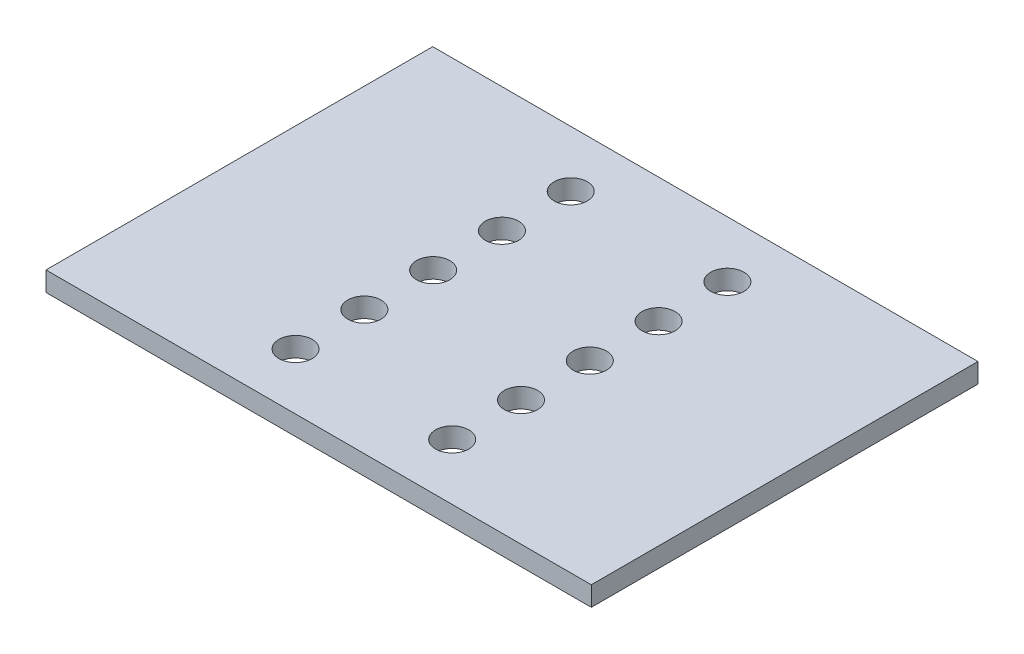
ISO-10303-21;
HEADER;
FILE_DESCRIPTION(('STEP AP214'),'2;1');
FILE_NAME('part.step','',(''),(''),'','','');
FILE_SCHEMA(('AUTOMOTIVE_DESIGN { 1 0 10303 214 1 1 1 1 }'));
ENDSEC;
DATA;
#1=APPLICATION_CONTEXT('core data for automotive mechanical design processes');
#2=APPLICATION_PROTOCOL_DEFINITION('international standard','automotive_design',2000,#1);
#3=PRODUCT_CONTEXT('',#1,'mechanical');
#4=PRODUCT('Part','Part','',(#3));
#5=PRODUCT_RELATED_PRODUCT_CATEGORY('part','',(#4));
#6=PRODUCT_DEFINITION_FORMATION('','',#4);
#7=PRODUCT_DEFINITION_CONTEXT('part definition',#1,'design');
#8=PRODUCT_DEFINITION('design','',#6,#7);
#9=PRODUCT_DEFINITION_SHAPE('','',#8);
#10=(LENGTH_UNIT() NAMED_UNIT(*) SI_UNIT(.MILLI.,.METRE.));
#11=(NAMED_UNIT(*) PLANE_ANGLE_UNIT() SI_UNIT($,.RADIAN.));
#12=(NAMED_UNIT(*) SI_UNIT($,.STERADIAN.) SOLID_ANGLE_UNIT());
#13=UNCERTAINTY_MEASURE_WITH_UNIT(LENGTH_MEASURE(1.E-05),#10,'distance_accuracy_value','');
#14=(GEOMETRIC_REPRESENTATION_CONTEXT(3) GLOBAL_UNCERTAINTY_ASSIGNED_CONTEXT((#13)) GLOBAL_UNIT_ASSIGNED_CONTEXT((#10,
#11,#12)) REPRESENTATION_CONTEXT('',''));
#15=CARTESIAN_POINT('',(0.,0.,0.));
#16=DIRECTION('',(0.,0.,1.));
#17=DIRECTION('',(1.,0.,0.));
#18=AXIS2_PLACEMENT_3D('',#15,#16,#17);
#19=CARTESIAN_POINT('',(27.85,2.,-19.75));
#20=DIRECTION('',(1.,0.,0.));
#21=DIRECTION('',(0.,0.,-1.));
#22=AXIS2_PLACEMENT_3D('',#19,#20,#21);
#23=PLANE('',#22);
#24=DIRECTION('',(0.,0.,1.));
#25=VECTOR('',#24,1.);
#26=CARTESIAN_POINT('',(27.85,0.,-19.75));
#27=LINE('',#26,#25);
#28=CARTESIAN_POINT('',(27.85,0.,-19.75));
#29=VERTEX_POINT('',#28);
#30=CARTESIAN_POINT('',(27.85,0.,19.75));
#31=VERTEX_POINT('',#30);
#32=EDGE_CURVE('E117',#29,#31,#27,.T.);
#33=ORIENTED_EDGE('',*,*,#32,.F.);
#34=DIRECTION('',(0.,-1.,0.));
#35=VECTOR('',#34,1.);
#36=CARTESIAN_POINT('',(27.85,2.,-19.75));
#37=LINE('',#36,#35);
#38=CARTESIAN_POINT('',(27.85,2.,-19.75));
#39=VERTEX_POINT('',#38);
#40=EDGE_CURVE('E11',#39,#29,#37,.T.);
#41=ORIENTED_EDGE('',*,*,#40,.F.);
#42=DIRECTION('',(0.,0.,1.));
#43=VECTOR('',#42,1.);
#44=CARTESIAN_POINT('',(27.85,2.,-19.75));
#45=LINE('',#44,#43);
#46=CARTESIAN_POINT('',(27.85,2.,19.75));
#47=VERTEX_POINT('',#46);
#48=EDGE_CURVE('E109',#39,#47,#45,.T.);
#49=ORIENTED_EDGE('',*,*,#48,.T.);
#50=DIRECTION('',(0.,-1.,0.));
#51=VECTOR('',#50,1.);
#52=CARTESIAN_POINT('',(27.85,2.,19.75));
#53=LINE('',#52,#51);
#54=EDGE_CURVE('E48',#47,#31,#53,.T.);
#55=ORIENTED_EDGE('',*,*,#54,.T.);
#56=EDGE_LOOP('',(#33,#41,#49,#55));
#57=FACE_BOUND('',#56,.T.);
#58=ADVANCED_FACE('F45',(#57),#23,.T.);
#59=CARTESIAN_POINT('',(27.85,2.,-19.75));
#60=DIRECTION('',(0.,0.,1.));
#61=DIRECTION('',(1.,0.,0.));
#62=AXIS2_PLACEMENT_3D('',#59,#60,#61);
#63=PLANE('',#62);
#64=DIRECTION('',(-1.,0.,0.));
#65=VECTOR('',#64,1.);
#66=CARTESIAN_POINT('',(27.85,0.,-19.75));
#67=LINE('',#66,#65);
#68=CARTESIAN_POINT('',(-27.85,0.,-19.75));
#69=VERTEX_POINT('',#68);
#70=EDGE_CURVE('E79',#29,#69,#67,.T.);
#71=ORIENTED_EDGE('',*,*,#70,.T.);
#72=DIRECTION('',(0.,-1.,0.));
#73=VECTOR('',#72,1.);
#74=CARTESIAN_POINT('',(-27.85,2.,-19.75));
#75=LINE('',#74,#73);
#76=CARTESIAN_POINT('',(-27.85,2.,-19.75));
#77=VERTEX_POINT('',#76);
#78=EDGE_CURVE('E55',#77,#69,#75,.T.);
#79=ORIENTED_EDGE('',*,*,#78,.F.);
#80=DIRECTION('',(-1.,0.,0.));
#81=VECTOR('',#80,1.);
#82=CARTESIAN_POINT('',(27.85,2.,-19.75));
#83=LINE('',#82,#81);
#84=EDGE_CURVE('E96',#39,#77,#83,.T.);
#85=ORIENTED_EDGE('',*,*,#84,.F.);
#86=ORIENTED_EDGE('',*,*,#40,.T.);
#87=EDGE_LOOP('',(#71,#79,#85,#86));
#88=FACE_BOUND('',#87,.T.);
#89=ADVANCED_FACE('F134',(#88),#63,.F.);
#90=CARTESIAN_POINT('',(-27.85,2.,-19.75));
#91=DIRECTION('',(1.,0.,0.));
#92=DIRECTION('',(0.,0.,-1.));
#93=AXIS2_PLACEMENT_3D('',#90,#91,#92);
#94=PLANE('',#93);
#95=DIRECTION('',(0.,0.,1.));
#96=VECTOR('',#95,1.);
#97=CARTESIAN_POINT('',(-27.85,0.,-19.75));
#98=LINE('',#97,#96);
#99=CARTESIAN_POINT('',(-27.85,0.,19.75));
#100=VERTEX_POINT('',#99);
#101=EDGE_CURVE('E104',#69,#100,#98,.T.);
#102=ORIENTED_EDGE('',*,*,#101,.T.);
#103=DIRECTION('',(0.,-1.,0.));
#104=VECTOR('',#103,1.);
#105=CARTESIAN_POINT('',(-27.85,2.,19.75));
#106=LINE('',#105,#104);
#107=CARTESIAN_POINT('',(-27.85,2.,19.75));
#108=VERTEX_POINT('',#107);
#109=EDGE_CURVE('E101',#108,#100,#106,.T.);
#110=ORIENTED_EDGE('',*,*,#109,.F.);
#111=DIRECTION('',(0.,0.,1.));
#112=VECTOR('',#111,1.);
#113=CARTESIAN_POINT('',(-27.85,2.,-19.75));
#114=LINE('',#113,#112);
#115=EDGE_CURVE('E91',#77,#108,#114,.T.);
#116=ORIENTED_EDGE('',*,*,#115,.F.);
#117=ORIENTED_EDGE('',*,*,#78,.T.);
#118=EDGE_LOOP('',(#102,#110,#116,#117));
#119=FACE_BOUND('',#118,.T.);
#120=ADVANCED_FACE('F102',(#119),#94,.F.);
#121=CARTESIAN_POINT('',(27.85,2.,19.75));
#122=DIRECTION('',(0.,0.,1.));
#123=DIRECTION('',(1.,0.,0.));
#124=AXIS2_PLACEMENT_3D('',#121,#122,#123);
#125=PLANE('',#124);
#126=DIRECTION('',(-1.,0.,0.));
#127=VECTOR('',#126,1.);
#128=CARTESIAN_POINT('',(27.85,0.,19.75));
#129=LINE('',#128,#127);
#130=EDGE_CURVE('E121',#31,#100,#129,.T.);
#131=ORIENTED_EDGE('',*,*,#130,.F.);
#132=ORIENTED_EDGE('',*,*,#54,.F.);
#133=DIRECTION('',(-1.,0.,0.));
#134=VECTOR('',#133,1.);
#135=CARTESIAN_POINT('',(27.85,2.,19.75));
#136=LINE('',#135,#134);
#137=EDGE_CURVE('E95',#47,#108,#136,.T.);
#138=ORIENTED_EDGE('',*,*,#137,.T.);
#139=ORIENTED_EDGE('',*,*,#109,.T.);
#140=EDGE_LOOP('',(#131,#132,#138,#139));
#141=FACE_BOUND('',#140,.T.);
#142=ADVANCED_FACE('F107',(#141),#125,.T.);
#143=CARTESIAN_POINT('',(0.,2.,0.));
#144=DIRECTION('',(0.,-1.,0.));
#145=DIRECTION('',(0.,0.,-1.));
#146=AXIS2_PLACEMENT_3D('',#143,#144,#145);
#147=PLANE('',#146);
#148=CARTESIAN_POINT('',(7.94540313495553,2.,-0.00010645817878456));
#149=DIRECTION('',(0.,1.,0.));
#150=DIRECTION('',(0.,0.,-1.));
#151=AXIS2_PLACEMENT_3D('',#148,#149,#150);
#152=CIRCLE('',#151,1.7);
#153=CARTESIAN_POINT('',(7.94540313495553,2.,-1.70010645817879));
#154=VERTEX_POINT('',#153);
#155=EDGE_CURVE('E228',#154,#154,#152,.T.);
#156=ORIENTED_EDGE('',*,*,#155,.F.);
#157=EDGE_LOOP('',(#156));
#158=FACE_BOUND('',#157,.T.);
#159=CARTESIAN_POINT('',(-8.0818952975667,2.,6.99984031273182));
#160=DIRECTION('',(0.,1.,0.));
#161=DIRECTION('',(0.,0.,1.));
#162=AXIS2_PLACEMENT_3D('',#159,#160,#161);
#163=CIRCLE('',#162,1.7);
#164=CARTESIAN_POINT('',(-8.0818952975667,2.,8.69984031273182));
#165=VERTEX_POINT('',#164);
#166=EDGE_CURVE('E237',#165,#165,#163,.T.);
#167=ORIENTED_EDGE('',*,*,#166,.F.);
#168=EDGE_LOOP('',(#167));
#169=FACE_BOUND('',#168,.T.);
#170=CARTESIAN_POINT('',(7.9181047024333,2.,6.99984031273182));
#171=DIRECTION('',(0.,1.,0.));
#172=DIRECTION('',(0.,0.,-1.));
#173=AXIS2_PLACEMENT_3D('',#170,#171,#172);
#174=CIRCLE('',#173,1.7);
#175=CARTESIAN_POINT('',(7.9181047024333,2.,5.29984031273182));
#176=VERTEX_POINT('',#175);
#177=EDGE_CURVE('E216',#176,#176,#174,.T.);
#178=ORIENTED_EDGE('',*,*,#177,.F.);
#179=EDGE_LOOP('',(#178));
#180=FACE_BOUND('',#179,.T.);
#181=CARTESIAN_POINT('',(-8.10919373008894,2.,13.9997870836424));
#182=DIRECTION('',(0.,1.,0.));
#183=DIRECTION('',(0.,0.,1.));
#184=AXIS2_PLACEMENT_3D('',#181,#182,#183);
#185=CIRCLE('',#184,1.7);
#186=CARTESIAN_POINT('',(-8.10919373008894,2.,15.6997870836424));
#187=VERTEX_POINT('',#186);
#188=EDGE_CURVE('E212',#187,#187,#185,.T.);
#189=ORIENTED_EDGE('',*,*,#188,.F.);
#190=EDGE_LOOP('',(#189));
#191=FACE_BOUND('',#190,.T.);
#192=CARTESIAN_POINT('',(8.,2.,-14.));
#193=DIRECTION('',(0.,1.,0.));
#194=DIRECTION('',(0.,0.,-1.));
#195=AXIS2_PLACEMENT_3D('',#192,#193,#194);
#196=CIRCLE('',#195,1.7);
#197=CARTESIAN_POINT('',(8.,2.,-15.7));
#198=VERTEX_POINT('',#197);
#199=EDGE_CURVE('E269',#198,#198,#196,.T.);
#200=ORIENTED_EDGE('',*,*,#199,.F.);
#201=EDGE_LOOP('',(#200));
#202=FACE_BOUND('',#201,.T.);
#203=CARTESIAN_POINT('',(-8.,2.,-14.));
#204=DIRECTION('',(0.,1.,0.));
#205=DIRECTION('',(0.,0.,1.));
#206=AXIS2_PLACEMENT_3D('',#203,#204,#205);
#207=CIRCLE('',#206,1.7);
#208=CARTESIAN_POINT('',(-8.,2.,-12.3));
#209=VERTEX_POINT('',#208);
#210=EDGE_CURVE('E261',#209,#209,#207,.T.);
#211=ORIENTED_EDGE('',*,*,#210,.F.);
#212=EDGE_LOOP('',(#211));
#213=FACE_BOUND('',#212,.T.);
#214=CARTESIAN_POINT('',(-8.05459686504447,2.,-0.00010645817878803));
#215=DIRECTION('',(0.,1.,0.));
#216=DIRECTION('',(0.,0.,1.));
#217=AXIS2_PLACEMENT_3D('',#214,#215,#216);
#218=CIRCLE('',#217,1.7);
#219=CARTESIAN_POINT('',(-8.05459686504447,2.,1.69989354182121));
#220=VERTEX_POINT('',#219);
#221=EDGE_CURVE('E253',#220,#220,#218,.T.);
#222=ORIENTED_EDGE('',*,*,#221,.F.);
#223=EDGE_LOOP('',(#222));
#224=FACE_BOUND('',#223,.T.);
#225=CARTESIAN_POINT('',(7.97270156747777,2.,-7.00005322908939));
#226=DIRECTION('',(0.,1.,0.));
#227=DIRECTION('',(0.,0.,-1.));
#228=AXIS2_PLACEMENT_3D('',#225,#226,#227);
#229=CIRCLE('',#228,1.7);
#230=CARTESIAN_POINT('',(7.97270156747777,2.,-8.70005322908939));
#231=VERTEX_POINT('',#230);
#232=EDGE_CURVE('E244',#231,#231,#229,.T.);
#233=ORIENTED_EDGE('',*,*,#232,.F.);
#234=EDGE_LOOP('',(#233));
#235=FACE_BOUND('',#234,.T.);
#236=CARTESIAN_POINT('',(7.89080626991106,2.,13.9997870836424));
#237=DIRECTION('',(0.,1.,0.));
#238=DIRECTION('',(0.,0.,-1.));
#239=AXIS2_PLACEMENT_3D('',#236,#237,#238);
#240=CIRCLE('',#239,1.7);
#241=CARTESIAN_POINT('',(7.89080626991106,2.,12.2997870836424));
#242=VERTEX_POINT('',#241);
#243=EDGE_CURVE('E204',#242,#242,#240,.T.);
#244=ORIENTED_EDGE('',*,*,#243,.F.);
#245=EDGE_LOOP('',(#244));
#246=FACE_BOUND('',#245,.T.);
#247=CARTESIAN_POINT('',(-8.02729843252223,2.,-7.00005322908939));
#248=DIRECTION('',(0.,1.,0.));
#249=DIRECTION('',(0.,0.,1.));
#250=AXIS2_PLACEMENT_3D('',#247,#248,#249);
#251=CIRCLE('',#250,1.7);
#252=CARTESIAN_POINT('',(-8.02729843252223,2.,-5.30005322908939));
#253=VERTEX_POINT('',#252);
#254=EDGE_CURVE('E248',#253,#253,#251,.T.);
#255=ORIENTED_EDGE('',*,*,#254,.F.);
#256=EDGE_LOOP('',(#255));
#257=FACE_BOUND('',#256,.T.);
#258=ORIENTED_EDGE('',*,*,#48,.F.);
#259=ORIENTED_EDGE('',*,*,#84,.T.);
#260=ORIENTED_EDGE('',*,*,#115,.T.);
#261=ORIENTED_EDGE('',*,*,#137,.F.);
#262=EDGE_LOOP('',(#258,#259,#260,#261));
#263=FACE_BOUND('',#262,.T.);
#264=ADVANCED_FACE('F94',(#158,#169,#180,#191,#202,#213,#224,#235,#246,#257,#263),#147,.F.);
#265=CARTESIAN_POINT('',(0.,0.,0.));
#266=DIRECTION('',(0.,-1.,0.));
#267=DIRECTION('',(0.,0.,-1.));
#268=AXIS2_PLACEMENT_3D('',#265,#266,#267);
#269=PLANE('',#268);
#270=CARTESIAN_POINT('',(7.94540313495553,0.,-0.00010645817878456));
#271=DIRECTION('',(0.,1.,0.));
#272=DIRECTION('',(0.,0.,-1.));
#273=AXIS2_PLACEMENT_3D('',#270,#271,#272);
#274=CIRCLE('',#273,1.7);
#275=CARTESIAN_POINT('',(7.94540313495553,0.,-1.70010645817879));
#276=VERTEX_POINT('',#275);
#277=EDGE_CURVE('E233',#276,#276,#274,.T.);
#278=ORIENTED_EDGE('',*,*,#277,.T.);
#279=EDGE_LOOP('',(#278));
#280=FACE_BOUND('',#279,.T.);
#281=CARTESIAN_POINT('',(-8.0818952975667,0.,6.99984031273182));
#282=DIRECTION('',(0.,1.,0.));
#283=DIRECTION('',(0.,0.,1.));
#284=AXIS2_PLACEMENT_3D('',#281,#282,#283);
#285=CIRCLE('',#284,1.7);
#286=CARTESIAN_POINT('',(-8.0818952975667,0.,8.69984031273182));
#287=VERTEX_POINT('',#286);
#288=EDGE_CURVE('E220',#287,#287,#285,.T.);
#289=ORIENTED_EDGE('',*,*,#288,.T.);
#290=EDGE_LOOP('',(#289));
#291=FACE_BOUND('',#290,.T.);
#292=CARTESIAN_POINT('',(7.9181047024333,0.,6.99984031273182));
#293=DIRECTION('',(0.,1.,0.));
#294=DIRECTION('',(0.,0.,-1.));
#295=AXIS2_PLACEMENT_3D('',#292,#293,#294);
#296=CIRCLE('',#295,1.7);
#297=CARTESIAN_POINT('',(7.9181047024333,0.,5.29984031273182));
#298=VERTEX_POINT('',#297);
#299=EDGE_CURVE('E221',#298,#298,#296,.T.);
#300=ORIENTED_EDGE('',*,*,#299,.T.);
#301=EDGE_LOOP('',(#300));
#302=FACE_BOUND('',#301,.T.);
#303=CARTESIAN_POINT('',(-8.10919373008894,0.,13.9997870836424));
#304=DIRECTION('',(0.,1.,0.));
#305=DIRECTION('',(0.,0.,1.));
#306=AXIS2_PLACEMENT_3D('',#303,#304,#305);
#307=CIRCLE('',#306,1.7);
#308=CARTESIAN_POINT('',(-8.10919373008894,0.,15.6997870836424));
#309=VERTEX_POINT('',#308);
#310=EDGE_CURVE('E207',#309,#309,#307,.T.);
#311=ORIENTED_EDGE('',*,*,#310,.T.);
#312=EDGE_LOOP('',(#311));
#313=FACE_BOUND('',#312,.T.);
#314=CARTESIAN_POINT('',(8.,0.,-14.));
#315=DIRECTION('',(0.,1.,0.));
#316=DIRECTION('',(0.,0.,-1.));
#317=AXIS2_PLACEMENT_3D('',#314,#315,#316);
#318=CIRCLE('',#317,1.7);
#319=CARTESIAN_POINT('',(8.,0.,-15.7));
#320=VERTEX_POINT('',#319);
#321=EDGE_CURVE('E232',#320,#320,#318,.T.);
#322=ORIENTED_EDGE('',*,*,#321,.T.);
#323=EDGE_LOOP('',(#322));
#324=FACE_BOUND('',#323,.T.);
#325=CARTESIAN_POINT('',(-8.,0.,-14.));
#326=DIRECTION('',(0.,1.,0.));
#327=DIRECTION('',(0.,0.,1.));
#328=AXIS2_PLACEMENT_3D('',#325,#326,#327);
#329=CIRCLE('',#328,1.7);
#330=CARTESIAN_POINT('',(-8.,0.,-12.3));
#331=VERTEX_POINT('',#330);
#332=EDGE_CURVE('E265',#331,#331,#329,.T.);
#333=ORIENTED_EDGE('',*,*,#332,.T.);
#334=EDGE_LOOP('',(#333));
#335=FACE_BOUND('',#334,.T.);
#336=CARTESIAN_POINT('',(-8.05459686504447,0.,-0.00010645817878803));
#337=DIRECTION('',(0.,1.,0.));
#338=DIRECTION('',(0.,0.,1.));
#339=AXIS2_PLACEMENT_3D('',#336,#337,#338);
#340=CIRCLE('',#339,1.7);
#341=CARTESIAN_POINT('',(-8.05459686504447,0.,1.69989354182121));
#342=VERTEX_POINT('',#341);
#343=EDGE_CURVE('E257',#342,#342,#340,.T.);
#344=ORIENTED_EDGE('',*,*,#343,.T.);
#345=EDGE_LOOP('',(#344));
#346=FACE_BOUND('',#345,.T.);
#347=CARTESIAN_POINT('',(7.97270156747777,0.,-7.00005322908939));
#348=DIRECTION('',(0.,1.,0.));
#349=DIRECTION('',(0.,0.,-1.));
#350=AXIS2_PLACEMENT_3D('',#347,#348,#349);
#351=CIRCLE('',#350,1.7);
#352=CARTESIAN_POINT('',(7.97270156747777,0.,-8.70005322908939));
#353=VERTEX_POINT('',#352);
#354=EDGE_CURVE('E249',#353,#353,#351,.T.);
#355=ORIENTED_EDGE('',*,*,#354,.T.);
#356=EDGE_LOOP('',(#355));
#357=FACE_BOUND('',#356,.T.);
#358=CARTESIAN_POINT('',(7.89080626991106,0.,13.9997870836424));
#359=DIRECTION('',(0.,1.,0.));
#360=DIRECTION('',(0.,0.,-1.));
#361=AXIS2_PLACEMENT_3D('',#358,#359,#360);
#362=CIRCLE('',#361,1.7);
#363=CARTESIAN_POINT('',(7.89080626991106,0.,12.2997870836424));
#364=VERTEX_POINT('',#363);
#365=EDGE_CURVE('E201',#364,#364,#362,.T.);
#366=ORIENTED_EDGE('',*,*,#365,.T.);
#367=EDGE_LOOP('',(#366));
#368=FACE_BOUND('',#367,.T.);
#369=CARTESIAN_POINT('',(-8.02729843252223,0.,-7.00005322908939));
#370=DIRECTION('',(0.,1.,0.));
#371=DIRECTION('',(0.,0.,1.));
#372=AXIS2_PLACEMENT_3D('',#369,#370,#371);
#373=CIRCLE('',#372,1.7);
#374=CARTESIAN_POINT('',(-8.02729843252223,0.,-5.30005322908939));
#375=VERTEX_POINT('',#374);
#376=EDGE_CURVE('E122',#375,#375,#373,.T.);
#377=ORIENTED_EDGE('',*,*,#376,.T.);
#378=EDGE_LOOP('',(#377));
#379=FACE_BOUND('',#378,.T.);
#380=ORIENTED_EDGE('',*,*,#32,.T.);
#381=ORIENTED_EDGE('',*,*,#130,.T.);
#382=ORIENTED_EDGE('',*,*,#101,.F.);
#383=ORIENTED_EDGE('',*,*,#70,.F.);
#384=EDGE_LOOP('',(#380,#381,#382,#383));
#385=FACE_BOUND('',#384,.T.);
#386=ADVANCED_FACE('F131',(#280,#291,#302,#313,#324,#335,#346,#357,#368,#379,#385),#269,.T.);
#387=CARTESIAN_POINT('',(-8.02729843252223,0.,-7.00005322908939));
#388=DIRECTION('',(0.,1.,0.));
#389=DIRECTION('',(0.,0.,1.));
#390=AXIS2_PLACEMENT_3D('',#387,#388,#389);
#391=CYLINDRICAL_SURFACE('',#390,1.7);
#392=ORIENTED_EDGE('',*,*,#376,.F.);
#393=EDGE_LOOP('',(#392));
#394=FACE_BOUND('',#393,.T.);
#395=ORIENTED_EDGE('',*,*,#254,.T.);
#396=EDGE_LOOP('',(#395));
#397=FACE_BOUND('',#396,.T.);
#398=ADVANCED_FACE('F153',(#394,#397),#391,.F.);
#399=CARTESIAN_POINT('',(7.89080626991106,0.,13.9997870836424));
#400=DIRECTION('',(0.,1.,0.));
#401=DIRECTION('',(0.,0.,1.));
#402=AXIS2_PLACEMENT_3D('',#399,#400,#401);
#403=CYLINDRICAL_SURFACE('',#402,1.7);
#404=ORIENTED_EDGE('',*,*,#365,.F.);
#405=EDGE_LOOP('',(#404));
#406=FACE_BOUND('',#405,.T.);
#407=ORIENTED_EDGE('',*,*,#243,.T.);
#408=EDGE_LOOP('',(#407));
#409=FACE_BOUND('',#408,.T.);
#410=ADVANCED_FACE('F160',(#406,#409),#403,.F.);
#411=CARTESIAN_POINT('',(7.97270156747777,0.,-7.00005322908939));
#412=DIRECTION('',(0.,1.,0.));
#413=DIRECTION('',(0.,0.,1.));
#414=AXIS2_PLACEMENT_3D('',#411,#412,#413);
#415=CYLINDRICAL_SURFACE('',#414,1.7);
#416=ORIENTED_EDGE('',*,*,#354,.F.);
#417=EDGE_LOOP('',(#416));
#418=FACE_BOUND('',#417,.T.);
#419=ORIENTED_EDGE('',*,*,#232,.T.);
#420=EDGE_LOOP('',(#419));
#421=FACE_BOUND('',#420,.T.);
#422=ADVANCED_FACE('F174',(#418,#421),#415,.F.);
#423=CARTESIAN_POINT('',(-8.05459686504447,0.,-0.00010645817878803));
#424=DIRECTION('',(0.,1.,0.));
#425=DIRECTION('',(0.,0.,1.));
#426=AXIS2_PLACEMENT_3D('',#423,#424,#425);
#427=CYLINDRICAL_SURFACE('',#426,1.7);
#428=ORIENTED_EDGE('',*,*,#343,.F.);
#429=EDGE_LOOP('',(#428));
#430=FACE_BOUND('',#429,.T.);
#431=ORIENTED_EDGE('',*,*,#221,.T.);
#432=EDGE_LOOP('',(#431));
#433=FACE_BOUND('',#432,.T.);
#434=ADVANCED_FACE('F170',(#430,#433),#427,.F.);
#435=CARTESIAN_POINT('',(-8.,0.,-14.));
#436=DIRECTION('',(0.,1.,0.));
#437=DIRECTION('',(0.,0.,1.));
#438=AXIS2_PLACEMENT_3D('',#435,#436,#437);
#439=CYLINDRICAL_SURFACE('',#438,1.7);
#440=ORIENTED_EDGE('',*,*,#332,.F.);
#441=EDGE_LOOP('',(#440));
#442=FACE_BOUND('',#441,.T.);
#443=ORIENTED_EDGE('',*,*,#210,.T.);
#444=EDGE_LOOP('',(#443));
#445=FACE_BOUND('',#444,.T.);
#446=ADVANCED_FACE('F166',(#442,#445),#439,.F.);
#447=CARTESIAN_POINT('',(8.,0.,-14.));
#448=DIRECTION('',(0.,1.,0.));
#449=DIRECTION('',(0.,0.,1.));
#450=AXIS2_PLACEMENT_3D('',#447,#448,#449);
#451=CYLINDRICAL_SURFACE('',#450,1.7);
#452=ORIENTED_EDGE('',*,*,#321,.F.);
#453=EDGE_LOOP('',(#452));
#454=FACE_BOUND('',#453,.T.);
#455=ORIENTED_EDGE('',*,*,#199,.T.);
#456=EDGE_LOOP('',(#455));
#457=FACE_BOUND('',#456,.T.);
#458=ADVANCED_FACE('F162',(#454,#457),#451,.F.);
#459=CARTESIAN_POINT('',(-8.10919373008894,0.,13.9997870836424));
#460=DIRECTION('',(0.,1.,0.));
#461=DIRECTION('',(0.,0.,1.));
#462=AXIS2_PLACEMENT_3D('',#459,#460,#461);
#463=CYLINDRICAL_SURFACE('',#462,1.7);
#464=ORIENTED_EDGE('',*,*,#310,.F.);
#465=EDGE_LOOP('',(#464));
#466=FACE_BOUND('',#465,.T.);
#467=ORIENTED_EDGE('',*,*,#188,.T.);
#468=EDGE_LOOP('',(#467));
#469=FACE_BOUND('',#468,.T.);
#470=ADVANCED_FACE('F165',(#466,#469),#463,.F.);
#471=CARTESIAN_POINT('',(7.9181047024333,0.,6.99984031273182));
#472=DIRECTION('',(0.,1.,0.));
#473=DIRECTION('',(0.,0.,1.));
#474=AXIS2_PLACEMENT_3D('',#471,#472,#473);
#475=CYLINDRICAL_SURFACE('',#474,1.7);
#476=ORIENTED_EDGE('',*,*,#299,.F.);
#477=EDGE_LOOP('',(#476));
#478=FACE_BOUND('',#477,.T.);
#479=ORIENTED_EDGE('',*,*,#177,.T.);
#480=EDGE_LOOP('',(#479));
#481=FACE_BOUND('',#480,.T.);
#482=ADVANCED_FACE('F183',(#478,#481),#475,.F.);
#483=CARTESIAN_POINT('',(-8.0818952975667,0.,6.99984031273182));
#484=DIRECTION('',(0.,1.,0.));
#485=DIRECTION('',(0.,0.,1.));
#486=AXIS2_PLACEMENT_3D('',#483,#484,#485);
#487=CYLINDRICAL_SURFACE('',#486,1.7);
#488=ORIENTED_EDGE('',*,*,#288,.F.);
#489=EDGE_LOOP('',(#488));
#490=FACE_BOUND('',#489,.T.);
#491=ORIENTED_EDGE('',*,*,#166,.T.);
#492=EDGE_LOOP('',(#491));
#493=FACE_BOUND('',#492,.T.);
#494=ADVANCED_FACE('F179',(#490,#493),#487,.F.);
#495=CARTESIAN_POINT('',(7.94540313495553,0.,-0.00010645817878456));
#496=DIRECTION('',(0.,1.,0.));
#497=DIRECTION('',(0.,0.,1.));
#498=AXIS2_PLACEMENT_3D('',#495,#496,#497);
#499=CYLINDRICAL_SURFACE('',#498,1.7);
#500=ORIENTED_EDGE('',*,*,#277,.F.);
#501=EDGE_LOOP('',(#500));
#502=FACE_BOUND('',#501,.T.);
#503=ORIENTED_EDGE('',*,*,#155,.T.);
#504=EDGE_LOOP('',(#503));
#505=FACE_BOUND('',#504,.T.);
#506=ADVANCED_FACE('F182',(#502,#505),#499,.F.);
#507=CLOSED_SHELL('',(#58,#89,#120,#142,#264,#386,#398,#410,#422,#434,#446,#458,#470,#482,#494,#506));
#508=MANIFOLD_SOLID_BREP('B2',#507);
#509=ADVANCED_BREP_SHAPE_REPRESENTATION('',(#18,#508),#14);
#510=SHAPE_DEFINITION_REPRESENTATION(#9,#509);
ENDSEC;
END-ISO-10303-21;
